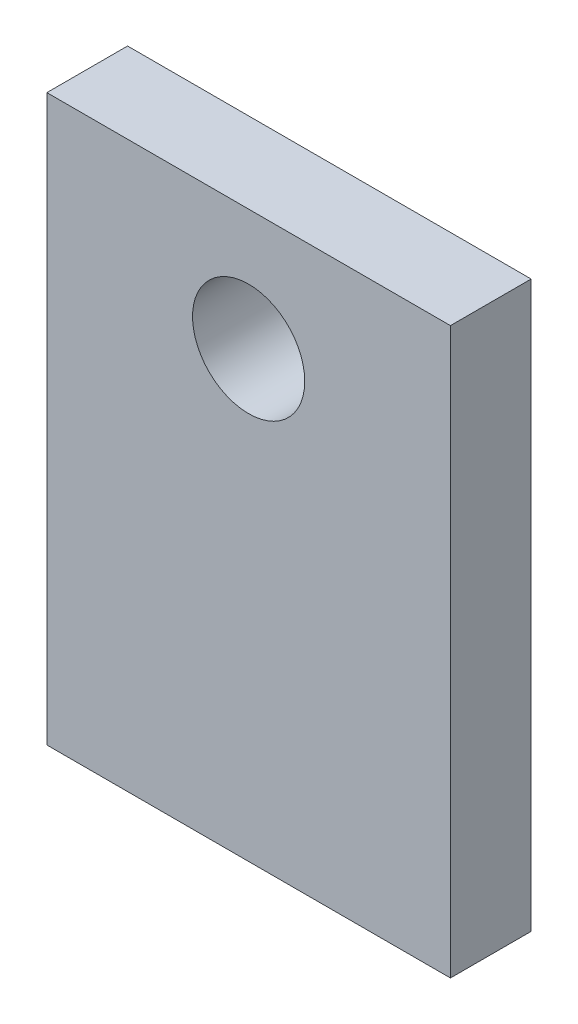
ISO-10303-21;
HEADER;
FILE_DESCRIPTION(('STEP AP214'),'2;1');
FILE_NAME('part.step','',(''),(''),'','','');
FILE_SCHEMA(('AUTOMOTIVE_DESIGN { 1 0 10303 214 1 1 1 1 }'));
ENDSEC;
DATA;
#1=APPLICATION_CONTEXT('core data for automotive mechanical design processes');
#2=APPLICATION_PROTOCOL_DEFINITION('international standard','automotive_design',2000,#1);
#3=PRODUCT_CONTEXT('',#1,'mechanical');
#4=PRODUCT('Part','Part','',(#3));
#5=PRODUCT_RELATED_PRODUCT_CATEGORY('part','',(#4));
#6=PRODUCT_DEFINITION_FORMATION('','',#4);
#7=PRODUCT_DEFINITION_CONTEXT('part definition',#1,'design');
#8=PRODUCT_DEFINITION('design','',#6,#7);
#9=PRODUCT_DEFINITION_SHAPE('','',#8);
#10=(LENGTH_UNIT() NAMED_UNIT(*) SI_UNIT(.MILLI.,.METRE.));
#11=(NAMED_UNIT(*) PLANE_ANGLE_UNIT() SI_UNIT($,.RADIAN.));
#12=(NAMED_UNIT(*) SI_UNIT($,.STERADIAN.) SOLID_ANGLE_UNIT());
#13=UNCERTAINTY_MEASURE_WITH_UNIT(LENGTH_MEASURE(1.E-05),#10,'distance_accuracy_value','');
#14=(GEOMETRIC_REPRESENTATION_CONTEXT(3) GLOBAL_UNCERTAINTY_ASSIGNED_CONTEXT((#13)) GLOBAL_UNIT_ASSIGNED_CONTEXT((#10,
#11,#12)) REPRESENTATION_CONTEXT('',''));
#15=CARTESIAN_POINT('',(0.,0.,0.));
#16=DIRECTION('',(0.,0.,1.));
#17=DIRECTION('',(1.,0.,0.));
#18=AXIS2_PLACEMENT_3D('',#15,#16,#17);
#19=CARTESIAN_POINT('',(0.,177.8,25.4));
#20=DIRECTION('',(0.,0.,-1.));
#21=DIRECTION('',(-1.,0.,0.));
#22=AXIS2_PLACEMENT_3D('',#19,#20,#21);
#23=PLANE('',#22);
#24=DIRECTION('',(0.,-1.,0.));
#25=VECTOR('',#24,1.);
#26=CARTESIAN_POINT('',(0.,0.,25.4));
#27=LINE('',#26,#25);
#28=CARTESIAN_POINT('',(0.,177.8,25.4));
#29=VERTEX_POINT('',#28);
#30=CARTESIAN_POINT('',(0.,0.,25.4));
#31=VERTEX_POINT('',#30);
#32=EDGE_CURVE('E82',#29,#31,#27,.T.);
#33=ORIENTED_EDGE('',*,*,#32,.T.);
#34=DIRECTION('',(1.,0.,0.));
#35=VECTOR('',#34,1.);
#36=CARTESIAN_POINT('',(0.,0.,25.4));
#37=LINE('',#36,#35);
#38=CARTESIAN_POINT('',(127.,0.,25.4));
#39=VERTEX_POINT('',#38);
#40=EDGE_CURVE('E77',#31,#39,#37,.T.);
#41=ORIENTED_EDGE('',*,*,#40,.T.);
#42=DIRECTION('',(0.,1.,0.));
#43=VECTOR('',#42,1.);
#44=CARTESIAN_POINT('',(127.,0.,25.4));
#45=LINE('',#44,#43);
#46=CARTESIAN_POINT('',(127.,177.8,25.4));
#47=VERTEX_POINT('',#46);
#48=EDGE_CURVE('E80',#39,#47,#45,.T.);
#49=ORIENTED_EDGE('',*,*,#48,.T.);
#50=DIRECTION('',(-1.,0.,0.));
#51=VECTOR('',#50,1.);
#52=CARTESIAN_POINT('',(0.,177.8,25.4));
#53=LINE('',#52,#51);
#54=EDGE_CURVE('E47',#47,#29,#53,.T.);
#55=ORIENTED_EDGE('',*,*,#54,.T.);
#56=EDGE_LOOP('',(#33,#41,#49,#55));
#57=FACE_BOUND('',#56,.T.);
#58=CARTESIAN_POINT('',(63.5,139.7,25.4));
#59=DIRECTION('',(0.,0.,1.));
#60=DIRECTION('',(1.,0.,0.));
#61=AXIS2_PLACEMENT_3D('',#58,#59,#60);
#62=CIRCLE('',#61,17.653);
#63=CARTESIAN_POINT('',(81.153,139.7,25.4));
#64=VERTEX_POINT('',#63);
#65=EDGE_CURVE('E97',#64,#64,#62,.T.);
#66=ORIENTED_EDGE('',*,*,#65,.F.);
#67=EDGE_LOOP('',(#66));
#68=FACE_BOUND('',#67,.T.);
#69=ADVANCED_FACE('F30',(#57,#68),#23,.F.);
#70=CARTESIAN_POINT('',(0.,177.8,0.));
#71=DIRECTION('',(0.,0.,-1.));
#72=DIRECTION('',(-1.,0.,0.));
#73=AXIS2_PLACEMENT_3D('',#70,#71,#72);
#74=PLANE('',#73);
#75=DIRECTION('',(0.,-1.,0.));
#76=VECTOR('',#75,1.);
#77=CARTESIAN_POINT('',(0.,0.,0.));
#78=LINE('',#77,#76);
#79=CARTESIAN_POINT('',(0.,177.8,0.));
#80=VERTEX_POINT('',#79);
#81=CARTESIAN_POINT('',(0.,0.,0.));
#82=VERTEX_POINT('',#81);
#83=EDGE_CURVE('E94',#80,#82,#78,.T.);
#84=ORIENTED_EDGE('',*,*,#83,.F.);
#85=DIRECTION('',(-1.,0.,0.));
#86=VECTOR('',#85,1.);
#87=CARTESIAN_POINT('',(0.,177.8,0.));
#88=LINE('',#87,#86);
#89=CARTESIAN_POINT('',(127.,177.8,0.));
#90=VERTEX_POINT('',#89);
#91=EDGE_CURVE('E70',#90,#80,#88,.T.);
#92=ORIENTED_EDGE('',*,*,#91,.F.);
#93=DIRECTION('',(0.,1.,0.));
#94=VECTOR('',#93,1.);
#95=CARTESIAN_POINT('',(127.,0.,0.));
#96=LINE('',#95,#94);
#97=CARTESIAN_POINT('',(127.,0.,0.));
#98=VERTEX_POINT('',#97);
#99=EDGE_CURVE('E64',#98,#90,#96,.T.);
#100=ORIENTED_EDGE('',*,*,#99,.F.);
#101=DIRECTION('',(1.,0.,0.));
#102=VECTOR('',#101,1.);
#103=CARTESIAN_POINT('',(0.,0.,0.));
#104=LINE('',#103,#102);
#105=EDGE_CURVE('E86',#82,#98,#104,.T.);
#106=ORIENTED_EDGE('',*,*,#105,.F.);
#107=EDGE_LOOP('',(#84,#92,#100,#106));
#108=FACE_BOUND('',#107,.T.);
#109=CARTESIAN_POINT('',(63.5,139.7,0.));
#110=DIRECTION('',(0.,0.,1.));
#111=DIRECTION('',(1.,0.,0.));
#112=AXIS2_PLACEMENT_3D('',#109,#110,#111);
#113=CIRCLE('',#112,17.653);
#114=CARTESIAN_POINT('',(81.153,139.7,0.));
#115=VERTEX_POINT('',#114);
#116=EDGE_CURVE('E109',#115,#115,#113,.T.);
#117=ORIENTED_EDGE('',*,*,#116,.T.);
#118=EDGE_LOOP('',(#117));
#119=FACE_BOUND('',#118,.T.);
#120=ADVANCED_FACE('F105',(#108,#119),#74,.T.);
#121=CARTESIAN_POINT('',(0.,0.,25.4));
#122=DIRECTION('',(1.,0.,0.));
#123=DIRECTION('',(0.,0.,-1.));
#124=AXIS2_PLACEMENT_3D('',#121,#122,#123);
#125=PLANE('',#124);
#126=ORIENTED_EDGE('',*,*,#83,.T.);
#127=DIRECTION('',(0.,0.,-1.));
#128=VECTOR('',#127,1.);
#129=CARTESIAN_POINT('',(0.,0.,25.4));
#130=LINE('',#129,#128);
#131=EDGE_CURVE('E11',#31,#82,#130,.T.);
#132=ORIENTED_EDGE('',*,*,#131,.F.);
#133=ORIENTED_EDGE('',*,*,#32,.F.);
#134=DIRECTION('',(0.,0.,-1.));
#135=VECTOR('',#134,1.);
#136=CARTESIAN_POINT('',(0.,177.8,25.4));
#137=LINE('',#136,#135);
#138=EDGE_CURVE('E90',#29,#80,#137,.T.);
#139=ORIENTED_EDGE('',*,*,#138,.T.);
#140=EDGE_LOOP('',(#126,#132,#133,#139));
#141=FACE_BOUND('',#140,.T.);
#142=ADVANCED_FACE('F32',(#141),#125,.F.);
#143=CARTESIAN_POINT('',(0.,0.,25.4));
#144=DIRECTION('',(0.,1.,0.));
#145=DIRECTION('',(0.,0.,1.));
#146=AXIS2_PLACEMENT_3D('',#143,#144,#145);
#147=PLANE('',#146);
#148=ORIENTED_EDGE('',*,*,#105,.T.);
#149=DIRECTION('',(0.,0.,-1.));
#150=VECTOR('',#149,1.);
#151=CARTESIAN_POINT('',(127.,0.,25.4));
#152=LINE('',#151,#150);
#153=EDGE_CURVE('E39',#39,#98,#152,.T.);
#154=ORIENTED_EDGE('',*,*,#153,.F.);
#155=ORIENTED_EDGE('',*,*,#40,.F.);
#156=ORIENTED_EDGE('',*,*,#131,.T.);
#157=EDGE_LOOP('',(#148,#154,#155,#156));
#158=FACE_BOUND('',#157,.T.);
#159=ADVANCED_FACE('F85',(#158),#147,.F.);
#160=CARTESIAN_POINT('',(127.,0.,25.4));
#161=DIRECTION('',(-1.,0.,0.));
#162=DIRECTION('',(0.,0.,1.));
#163=AXIS2_PLACEMENT_3D('',#160,#161,#162);
#164=PLANE('',#163);
#165=ORIENTED_EDGE('',*,*,#99,.T.);
#166=DIRECTION('',(0.,0.,-1.));
#167=VECTOR('',#166,1.);
#168=CARTESIAN_POINT('',(127.,177.8,25.4));
#169=LINE('',#168,#167);
#170=EDGE_CURVE('E87',#47,#90,#169,.T.);
#171=ORIENTED_EDGE('',*,*,#170,.F.);
#172=ORIENTED_EDGE('',*,*,#48,.F.);
#173=ORIENTED_EDGE('',*,*,#153,.T.);
#174=EDGE_LOOP('',(#165,#171,#172,#173));
#175=FACE_BOUND('',#174,.T.);
#176=ADVANCED_FACE('F88',(#175),#164,.F.);
#177=CARTESIAN_POINT('',(0.,177.8,25.4));
#178=DIRECTION('',(0.,-1.,0.));
#179=DIRECTION('',(0.,0.,-1.));
#180=AXIS2_PLACEMENT_3D('',#177,#178,#179);
#181=PLANE('',#180);
#182=ORIENTED_EDGE('',*,*,#91,.T.);
#183=ORIENTED_EDGE('',*,*,#138,.F.);
#184=ORIENTED_EDGE('',*,*,#54,.F.);
#185=ORIENTED_EDGE('',*,*,#170,.T.);
#186=EDGE_LOOP('',(#182,#183,#184,#185));
#187=FACE_BOUND('',#186,.T.);
#188=ADVANCED_FACE('F102',(#187),#181,.F.);
#189=CARTESIAN_POINT('',(63.5,139.7,25.4));
#190=DIRECTION('',(0.,0.,-1.));
#191=DIRECTION('',(-1.,0.,0.));
#192=AXIS2_PLACEMENT_3D('',#189,#190,#191);
#193=CYLINDRICAL_SURFACE('',#192,17.653);
#194=ORIENTED_EDGE('',*,*,#65,.T.);
#195=EDGE_LOOP('',(#194));
#196=FACE_BOUND('',#195,.T.);
#197=ORIENTED_EDGE('',*,*,#116,.F.);
#198=EDGE_LOOP('',(#197));
#199=FACE_BOUND('',#198,.T.);
#200=ADVANCED_FACE('F115',(#196,#199),#193,.F.);
#201=CLOSED_SHELL('',(#69,#120,#142,#159,#176,#188,#200));
#202=MANIFOLD_SOLID_BREP('B2',#201);
#203=ADVANCED_BREP_SHAPE_REPRESENTATION('',(#18,#202),#14);
#204=SHAPE_DEFINITION_REPRESENTATION(#9,#203);
ENDSEC;
END-ISO-10303-21;
